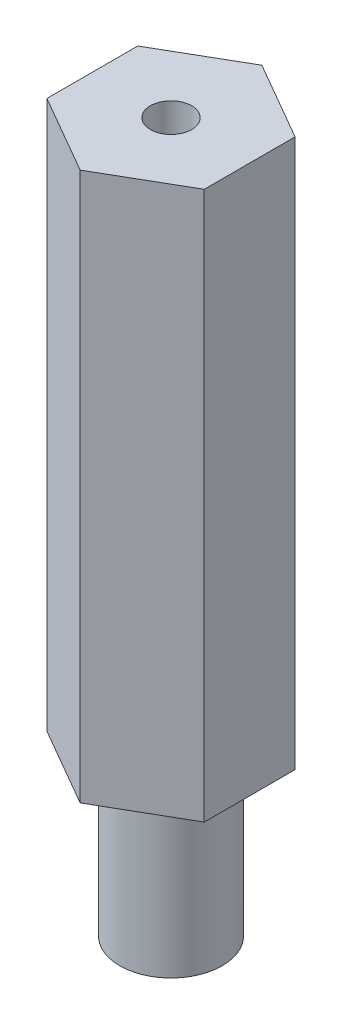
ISO-10303-21;
HEADER;
FILE_DESCRIPTION(('STEP AP214'),'2;1');
FILE_NAME('part.step','',(''),(''),'','','');
FILE_SCHEMA(('AUTOMOTIVE_DESIGN { 1 0 10303 214 1 1 1 1 }'));
ENDSEC;
DATA;
#1=APPLICATION_CONTEXT('core data for automotive mechanical design processes');
#2=APPLICATION_PROTOCOL_DEFINITION('international standard','automotive_design',2000,#1);
#3=PRODUCT_CONTEXT('',#1,'mechanical');
#4=PRODUCT('Part','Part','',(#3));
#5=PRODUCT_RELATED_PRODUCT_CATEGORY('part','',(#4));
#6=PRODUCT_DEFINITION_FORMATION('','',#4);
#7=PRODUCT_DEFINITION_CONTEXT('part definition',#1,'design');
#8=PRODUCT_DEFINITION('design','',#6,#7);
#9=PRODUCT_DEFINITION_SHAPE('','',#8);
#10=(LENGTH_UNIT() NAMED_UNIT(*) SI_UNIT(.MILLI.,.METRE.));
#11=(NAMED_UNIT(*) PLANE_ANGLE_UNIT() SI_UNIT($,.RADIAN.));
#12=(NAMED_UNIT(*) SI_UNIT($,.STERADIAN.) SOLID_ANGLE_UNIT());
#13=UNCERTAINTY_MEASURE_WITH_UNIT(LENGTH_MEASURE(1.E-05),#10,'distance_accuracy_value','');
#14=(GEOMETRIC_REPRESENTATION_CONTEXT(3) GLOBAL_UNCERTAINTY_ASSIGNED_CONTEXT((#13)) GLOBAL_UNIT_ASSIGNED_CONTEXT((#10,
#11,#12)) REPRESENTATION_CONTEXT('',''));
#15=CARTESIAN_POINT('',(0.,0.,0.));
#16=DIRECTION('',(0.,0.,1.));
#17=DIRECTION('',(1.,0.,0.));
#18=AXIS2_PLACEMENT_3D('',#15,#16,#17);
#19=CARTESIAN_POINT('',(2.2606,0.,-1.30515801853007));
#20=DIRECTION('',(0.,1.,0.));
#21=DIRECTION('',(0.,0.,1.));
#22=AXIS2_PLACEMENT_3D('',#19,#20,#21);
#23=PLANE('',#22);
#24=DIRECTION('',(0.,0.,-1.));
#25=VECTOR('',#24,1.);
#26=CARTESIAN_POINT('',(2.2606,0.,1.30515801853007));
#27=LINE('',#26,#25);
#28=CARTESIAN_POINT('',(2.2606,0.,1.30515801853007));
#29=VERTEX_POINT('',#28);
#30=CARTESIAN_POINT('',(2.2606,0.,-1.30515801853007));
#31=VERTEX_POINT('',#30);
#32=EDGE_CURVE('E136',#29,#31,#27,.T.);
#33=ORIENTED_EDGE('',*,*,#32,.F.);
#34=DIRECTION('',(0.866025403784438,0.,-0.5));
#35=VECTOR('',#34,1.);
#36=CARTESIAN_POINT('',(0.,0.,2.61031603706014));
#37=LINE('',#36,#35);
#38=CARTESIAN_POINT('',(0.,0.,2.61031603706014));
#39=VERTEX_POINT('',#38);
#40=EDGE_CURVE('E91',#39,#29,#37,.T.);
#41=ORIENTED_EDGE('',*,*,#40,.F.);
#42=DIRECTION('',(0.866025403784439,0.,0.5));
#43=VECTOR('',#42,1.);
#44=CARTESIAN_POINT('',(-2.2606,0.,1.30515801853007));
#45=LINE('',#44,#43);
#46=CARTESIAN_POINT('',(-2.2606,0.,1.30515801853007));
#47=VERTEX_POINT('',#46);
#48=EDGE_CURVE('E85',#47,#39,#45,.T.);
#49=ORIENTED_EDGE('',*,*,#48,.F.);
#50=DIRECTION('',(0.,0.,1.));
#51=VECTOR('',#50,1.);
#52=CARTESIAN_POINT('',(-2.2606,0.,-1.30515801853007));
#53=LINE('',#52,#51);
#54=CARTESIAN_POINT('',(-2.2606,0.,-1.30515801853007));
#55=VERTEX_POINT('',#54);
#56=EDGE_CURVE('E125',#55,#47,#53,.T.);
#57=ORIENTED_EDGE('',*,*,#56,.F.);
#58=DIRECTION('',(-0.866025403784439,0.,0.5));
#59=VECTOR('',#58,1.);
#60=CARTESIAN_POINT('',(0.,0.,-2.61031603706014));
#61=LINE('',#60,#59);
#62=CARTESIAN_POINT('',(0.,0.,-2.61031603706014));
#63=VERTEX_POINT('',#62);
#64=EDGE_CURVE('E144',#63,#55,#61,.T.);
#65=ORIENTED_EDGE('',*,*,#64,.F.);
#66=DIRECTION('',(-0.866025403784439,0.,-0.5));
#67=VECTOR('',#66,1.);
#68=CARTESIAN_POINT('',(2.2606,0.,-1.30515801853007));
#69=LINE('',#68,#67);
#70=EDGE_CURVE('E140',#31,#63,#69,.T.);
#71=ORIENTED_EDGE('',*,*,#70,.F.);
#72=EDGE_LOOP('',(#33,#41,#49,#57,#65,#71));
#73=FACE_BOUND('',#72,.T.);
#74=CARTESIAN_POINT('',(0.,0.,0.));
#75=DIRECTION('',(0.,1.,0.));
#76=DIRECTION('',(0.,0.,1.));
#77=AXIS2_PLACEMENT_3D('',#74,#75,#76);
#78=CIRCLE('',#77,1.4732);
#79=CARTESIAN_POINT('',(0.,0.,1.4732));
#80=VERTEX_POINT('',#79);
#81=EDGE_CURVE('E11',#80,#80,#78,.F.);
#82=ORIENTED_EDGE('',*,*,#81,.F.);
#83=EDGE_LOOP('',(#82));
#84=FACE_BOUND('',#83,.T.);
#85=ADVANCED_FACE('F38',(#73,#84),#23,.F.);
#86=CARTESIAN_POINT('',(2.2606,15.748,1.30515801853007));
#87=DIRECTION('',(-1.,0.,0.));
#88=DIRECTION('',(0.,0.,1.));
#89=AXIS2_PLACEMENT_3D('',#86,#87,#88);
#90=PLANE('',#89);
#91=ORIENTED_EDGE('',*,*,#32,.T.);
#92=DIRECTION('',(0.,-1.,0.));
#93=VECTOR('',#92,1.);
#94=CARTESIAN_POINT('',(2.2606,15.748,-1.30515801853007));
#95=LINE('',#94,#93);
#96=CARTESIAN_POINT('',(2.2606,15.748,-1.30515801853007));
#97=VERTEX_POINT('',#96);
#98=EDGE_CURVE('E48',#97,#31,#95,.T.);
#99=ORIENTED_EDGE('',*,*,#98,.F.);
#100=DIRECTION('',(0.,0.,-1.));
#101=VECTOR('',#100,1.);
#102=CARTESIAN_POINT('',(2.2606,15.748,1.30515801853007));
#103=LINE('',#102,#101);
#104=CARTESIAN_POINT('',(2.2606,15.748,1.30515801853007));
#105=VERTEX_POINT('',#104);
#106=EDGE_CURVE('E153',#105,#97,#103,.T.);
#107=ORIENTED_EDGE('',*,*,#106,.F.);
#108=DIRECTION('',(0.,-1.,0.));
#109=VECTOR('',#108,1.);
#110=CARTESIAN_POINT('',(2.2606,15.748,1.30515801853007));
#111=LINE('',#110,#109);
#112=EDGE_CURVE('E132',#105,#29,#111,.T.);
#113=ORIENTED_EDGE('',*,*,#112,.T.);
#114=EDGE_LOOP('',(#91,#99,#107,#113));
#115=FACE_BOUND('',#114,.T.);
#116=ADVANCED_FACE('F40',(#115),#90,.F.);
#117=CARTESIAN_POINT('',(2.2606,15.748,-1.30515801853007));
#118=DIRECTION('',(-0.5,0.,0.866025403784439));
#119=DIRECTION('',(0.866025403784438,0.,0.5));
#120=AXIS2_PLACEMENT_3D('',#117,#118,#119);
#121=PLANE('',#120);
#122=ORIENTED_EDGE('',*,*,#70,.T.);
#123=DIRECTION('',(0.,-1.,0.));
#124=VECTOR('',#123,1.);
#125=CARTESIAN_POINT('',(0.,15.748,-2.61031603706014));
#126=LINE('',#125,#124);
#127=CARTESIAN_POINT('',(0.,15.748,-2.61031603706014));
#128=VERTEX_POINT('',#127);
#129=EDGE_CURVE('E160',#128,#63,#126,.T.);
#130=ORIENTED_EDGE('',*,*,#129,.F.);
#131=DIRECTION('',(-0.866025403784439,0.,-0.5));
#132=VECTOR('',#131,1.);
#133=CARTESIAN_POINT('',(2.2606,15.748,-1.30515801853007));
#134=LINE('',#133,#132);
#135=EDGE_CURVE('E102',#97,#128,#134,.T.);
#136=ORIENTED_EDGE('',*,*,#135,.F.);
#137=ORIENTED_EDGE('',*,*,#98,.T.);
#138=EDGE_LOOP('',(#122,#130,#136,#137));
#139=FACE_BOUND('',#138,.T.);
#140=ADVANCED_FACE('F165',(#139),#121,.F.);
#141=CARTESIAN_POINT('',(0.,15.748,-2.61031603706014));
#142=DIRECTION('',(0.5,0.,0.866025403784439));
#143=DIRECTION('',(0.866025403784438,0.,-0.5));
#144=AXIS2_PLACEMENT_3D('',#141,#142,#143);
#145=PLANE('',#144);
#146=ORIENTED_EDGE('',*,*,#64,.T.);
#147=DIRECTION('',(0.,-1.,0.));
#148=VECTOR('',#147,1.);
#149=CARTESIAN_POINT('',(-2.2606,15.748,-1.30515801853007));
#150=LINE('',#149,#148);
#151=CARTESIAN_POINT('',(-2.2606,15.748,-1.30515801853007));
#152=VERTEX_POINT('',#151);
#153=EDGE_CURVE('E127',#152,#55,#150,.T.);
#154=ORIENTED_EDGE('',*,*,#153,.F.);
#155=DIRECTION('',(-0.866025403784439,0.,0.5));
#156=VECTOR('',#155,1.);
#157=CARTESIAN_POINT('',(0.,15.748,-2.61031603706014));
#158=LINE('',#157,#156);
#159=EDGE_CURVE('E116',#128,#152,#158,.T.);
#160=ORIENTED_EDGE('',*,*,#159,.F.);
#161=ORIENTED_EDGE('',*,*,#129,.T.);
#162=EDGE_LOOP('',(#146,#154,#160,#161));
#163=FACE_BOUND('',#162,.T.);
#164=ADVANCED_FACE('F173',(#163),#145,.F.);
#165=CARTESIAN_POINT('',(-2.2606,15.748,-1.30515801853007));
#166=DIRECTION('',(1.,0.,0.));
#167=DIRECTION('',(0.,0.,-1.));
#168=AXIS2_PLACEMENT_3D('',#165,#166,#167);
#169=PLANE('',#168);
#170=ORIENTED_EDGE('',*,*,#56,.T.);
#171=DIRECTION('',(0.,-1.,0.));
#172=VECTOR('',#171,1.);
#173=CARTESIAN_POINT('',(-2.2606,15.748,1.30515801853007));
#174=LINE('',#173,#172);
#175=CARTESIAN_POINT('',(-2.2606,15.748,1.30515801853007));
#176=VERTEX_POINT('',#175);
#177=EDGE_CURVE('E122',#176,#47,#174,.T.);
#178=ORIENTED_EDGE('',*,*,#177,.F.);
#179=DIRECTION('',(0.,0.,1.));
#180=VECTOR('',#179,1.);
#181=CARTESIAN_POINT('',(-2.2606,15.748,-1.30515801853007));
#182=LINE('',#181,#180);
#183=EDGE_CURVE('E110',#152,#176,#182,.T.);
#184=ORIENTED_EDGE('',*,*,#183,.F.);
#185=ORIENTED_EDGE('',*,*,#153,.T.);
#186=EDGE_LOOP('',(#170,#178,#184,#185));
#187=FACE_BOUND('',#186,.T.);
#188=ADVANCED_FACE('F123',(#187),#169,.F.);
#189=CARTESIAN_POINT('',(-2.2606,15.748,1.30515801853007));
#190=DIRECTION('',(0.5,0.,-0.866025403784439));
#191=DIRECTION('',(-0.866025403784438,0.,-0.5));
#192=AXIS2_PLACEMENT_3D('',#189,#190,#191);
#193=PLANE('',#192);
#194=ORIENTED_EDGE('',*,*,#48,.T.);
#195=DIRECTION('',(0.,-1.,0.));
#196=VECTOR('',#195,1.);
#197=CARTESIAN_POINT('',(0.,15.748,2.61031603706014));
#198=LINE('',#197,#196);
#199=CARTESIAN_POINT('',(0.,15.748,2.61031603706014));
#200=VERTEX_POINT('',#199);
#201=EDGE_CURVE('E128',#200,#39,#198,.T.);
#202=ORIENTED_EDGE('',*,*,#201,.F.);
#203=DIRECTION('',(0.866025403784439,0.,0.5));
#204=VECTOR('',#203,1.);
#205=CARTESIAN_POINT('',(-2.2606,15.748,1.30515801853007));
#206=LINE('',#205,#204);
#207=EDGE_CURVE('E114',#176,#200,#206,.T.);
#208=ORIENTED_EDGE('',*,*,#207,.F.);
#209=ORIENTED_EDGE('',*,*,#177,.T.);
#210=EDGE_LOOP('',(#194,#202,#208,#209));
#211=FACE_BOUND('',#210,.T.);
#212=ADVANCED_FACE('F130',(#211),#193,.F.);
#213=CARTESIAN_POINT('',(0.,15.748,2.61031603706014));
#214=DIRECTION('',(-0.5,0.,-0.866025403784439));
#215=DIRECTION('',(-0.866025403784439,0.,0.5));
#216=AXIS2_PLACEMENT_3D('',#213,#214,#215);
#217=PLANE('',#216);
#218=ORIENTED_EDGE('',*,*,#40,.T.);
#219=ORIENTED_EDGE('',*,*,#112,.F.);
#220=DIRECTION('',(0.866025403784438,0.,-0.5));
#221=VECTOR('',#220,1.);
#222=CARTESIAN_POINT('',(0.,15.748,2.61031603706014));
#223=LINE('',#222,#221);
#224=EDGE_CURVE('E56',#200,#105,#223,.T.);
#225=ORIENTED_EDGE('',*,*,#224,.F.);
#226=ORIENTED_EDGE('',*,*,#201,.T.);
#227=EDGE_LOOP('',(#218,#219,#225,#226));
#228=FACE_BOUND('',#227,.T.);
#229=ADVANCED_FACE('F203',(#228),#217,.F.);
#230=CARTESIAN_POINT('',(2.2606,15.748,-1.30515801853007));
#231=DIRECTION('',(0.,1.,0.));
#232=DIRECTION('',(0.,0.,1.));
#233=AXIS2_PLACEMENT_3D('',#230,#231,#232);
#234=PLANE('',#233);
#235=CARTESIAN_POINT('',(0.,15.748,0.));
#236=DIRECTION('',(0.,1.,0.));
#237=DIRECTION('',(0.,0.,1.));
#238=AXIS2_PLACEMENT_3D('',#235,#236,#237);
#239=CIRCLE('',#238,0.593671867306966);
#240=CARTESIAN_POINT('',(0.,15.748,0.593671867306966));
#241=VERTEX_POINT('',#240);
#242=EDGE_CURVE('E184',#241,#241,#239,.T.);
#243=ORIENTED_EDGE('',*,*,#242,.F.);
#244=EDGE_LOOP('',(#243));
#245=FACE_BOUND('',#244,.T.);
#246=ORIENTED_EDGE('',*,*,#106,.T.);
#247=ORIENTED_EDGE('',*,*,#135,.T.);
#248=ORIENTED_EDGE('',*,*,#159,.T.);
#249=ORIENTED_EDGE('',*,*,#183,.T.);
#250=ORIENTED_EDGE('',*,*,#207,.T.);
#251=ORIENTED_EDGE('',*,*,#224,.T.);
#252=EDGE_LOOP('',(#246,#247,#248,#249,#250,#251));
#253=FACE_BOUND('',#252,.T.);
#254=ADVANCED_FACE('F112',(#245,#253),#234,.T.);
#255=CARTESIAN_POINT('',(0.,-4.6228,0.));
#256=DIRECTION('',(0.,1.,0.));
#257=DIRECTION('',(0.,0.,1.));
#258=AXIS2_PLACEMENT_3D('',#255,#256,#257);
#259=CYLINDRICAL_SURFACE('',#258,1.4732);
#260=CARTESIAN_POINT('',(0.,-4.6228,0.));
#261=DIRECTION('',(0.,-1.,0.));
#262=DIRECTION('',(0.,0.,-1.));
#263=AXIS2_PLACEMENT_3D('',#260,#261,#262);
#264=CIRCLE('',#263,1.4732);
#265=CARTESIAN_POINT('',(0.,-4.6228,-1.4732));
#266=VERTEX_POINT('',#265);
#267=EDGE_CURVE('E141',#266,#266,#264,.T.);
#268=ORIENTED_EDGE('',*,*,#267,.F.);
#269=EDGE_LOOP('',(#268));
#270=FACE_BOUND('',#269,.T.);
#271=ORIENTED_EDGE('',*,*,#81,.T.);
#272=EDGE_LOOP('',(#271));
#273=FACE_BOUND('',#272,.T.);
#274=ADVANCED_FACE('F202',(#270,#273),#259,.T.);
#275=CARTESIAN_POINT('',(0.,-4.6228,0.));
#276=DIRECTION('',(0.,-1.,0.));
#277=DIRECTION('',(0.,0.,-1.));
#278=AXIS2_PLACEMENT_3D('',#275,#276,#277);
#279=PLANE('',#278);
#280=ORIENTED_EDGE('',*,*,#267,.T.);
#281=EDGE_LOOP('',(#280));
#282=FACE_BOUND('',#281,.T.);
#283=ADVANCED_FACE('F197',(#282),#279,.T.);
#284=CARTESIAN_POINT('',(0.,13.208,0.));
#285=DIRECTION('',(0.,1.,0.));
#286=DIRECTION('',(0.,0.,1.));
#287=AXIS2_PLACEMENT_3D('',#284,#285,#286);
#288=CYLINDRICAL_SURFACE('',#287,0.593671867306966);
#289=CARTESIAN_POINT('',(0.,13.208,0.));
#290=DIRECTION('',(0.,1.,0.));
#291=DIRECTION('',(0.,0.,1.));
#292=AXIS2_PLACEMENT_3D('',#289,#290,#291);
#293=CIRCLE('',#292,0.593671867306966);
#294=CARTESIAN_POINT('',(0.,13.208,0.593671867306966));
#295=VERTEX_POINT('',#294);
#296=EDGE_CURVE('E183',#295,#295,#293,.T.);
#297=ORIENTED_EDGE('',*,*,#296,.F.);
#298=EDGE_LOOP('',(#297));
#299=FACE_BOUND('',#298,.T.);
#300=ORIENTED_EDGE('',*,*,#242,.T.);
#301=EDGE_LOOP('',(#300));
#302=FACE_BOUND('',#301,.T.);
#303=ADVANCED_FACE('F194',(#299,#302),#288,.F.);
#304=CARTESIAN_POINT('',(0.,13.208,0.));
#305=DIRECTION('',(0.,1.,0.));
#306=DIRECTION('',(0.,0.,1.));
#307=AXIS2_PLACEMENT_3D('',#304,#305,#306);
#308=PLANE('',#307);
#309=ORIENTED_EDGE('',*,*,#296,.T.);
#310=EDGE_LOOP('',(#309));
#311=FACE_BOUND('',#310,.T.);
#312=ADVANCED_FACE('F192',(#311),#308,.T.);
#313=CLOSED_SHELL('',(#85,#116,#140,#164,#188,#212,#229,#254,#274,#283,#303,#312));
#314=MANIFOLD_SOLID_BREP('B2',#313);
#315=ADVANCED_BREP_SHAPE_REPRESENTATION('',(#18,#314),#14);
#316=SHAPE_DEFINITION_REPRESENTATION(#9,#315);
ENDSEC;
END-ISO-10303-21;
